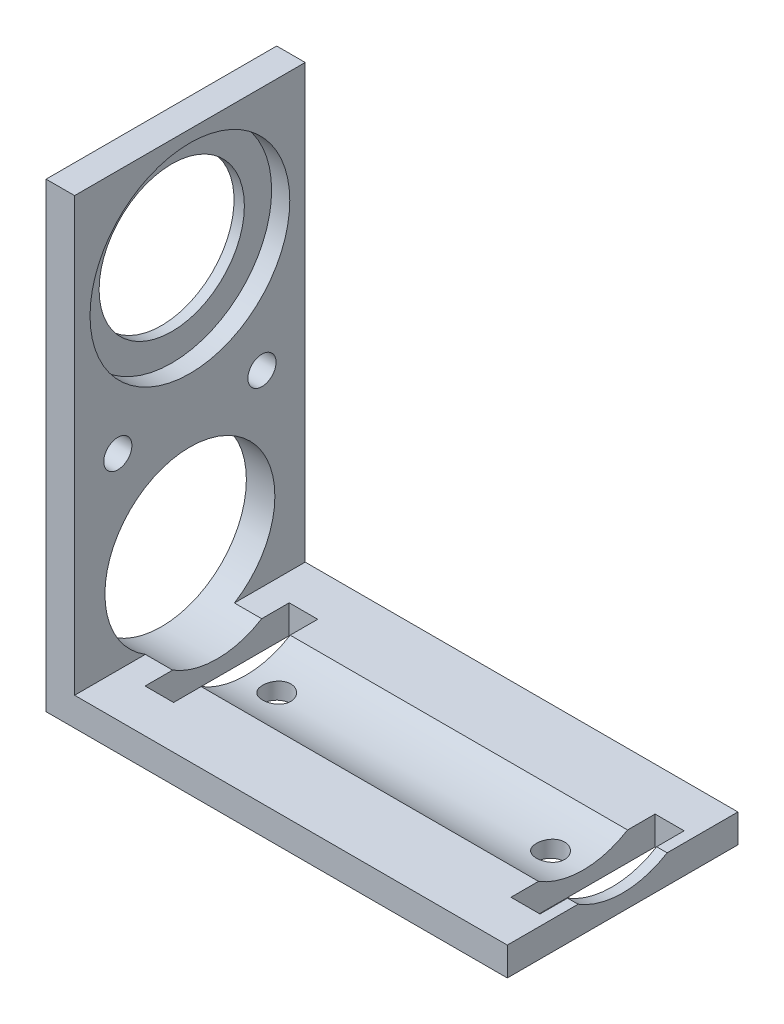
ISO-10303-21;
HEADER;
FILE_DESCRIPTION(('STEP AP214'),'2;1');
FILE_NAME('part.step','',(''),(''),'','','');
FILE_SCHEMA(('AUTOMOTIVE_DESIGN { 1 0 10303 214 1 1 1 1 }'));
ENDSEC;
DATA;
#1=APPLICATION_CONTEXT('core data for automotive mechanical design processes');
#2=APPLICATION_PROTOCOL_DEFINITION('international standard','automotive_design',2000,#1);
#3=PRODUCT_CONTEXT('',#1,'mechanical');
#4=PRODUCT('Part','Part','',(#3));
#5=PRODUCT_RELATED_PRODUCT_CATEGORY('part','',(#4));
#6=PRODUCT_DEFINITION_FORMATION('','',#4);
#7=PRODUCT_DEFINITION_CONTEXT('part definition',#1,'design');
#8=PRODUCT_DEFINITION('design','',#6,#7);
#9=PRODUCT_DEFINITION_SHAPE('','',#8);
#10=(LENGTH_UNIT() NAMED_UNIT(*) SI_UNIT(.MILLI.,.METRE.));
#11=(NAMED_UNIT(*) PLANE_ANGLE_UNIT() SI_UNIT($,.RADIAN.));
#12=(NAMED_UNIT(*) SI_UNIT($,.STERADIAN.) SOLID_ANGLE_UNIT());
#13=UNCERTAINTY_MEASURE_WITH_UNIT(LENGTH_MEASURE(1.E-05),#10,'distance_accuracy_value','');
#14=(GEOMETRIC_REPRESENTATION_CONTEXT(3) GLOBAL_UNCERTAINTY_ASSIGNED_CONTEXT((#13)) GLOBAL_UNIT_ASSIGNED_CONTEXT((#10,
#11,#12)) REPRESENTATION_CONTEXT('',''));
#15=CARTESIAN_POINT('',(0.,0.,0.));
#16=DIRECTION('',(0.,0.,1.));
#17=DIRECTION('',(1.,0.,0.));
#18=AXIS2_PLACEMENT_3D('',#15,#16,#17);
#19=CARTESIAN_POINT('',(50.8,11.1125,12.7));
#20=DIRECTION('',(-1.,0.,0.));
#21=DIRECTION('',(0.,0.,1.));
#22=AXIS2_PLACEMENT_3D('',#19,#20,#21);
#23=CYLINDRICAL_SURFACE('',#22,9.36);
#24=DIRECTION('',(-1.,0.,0.));
#25=VECTOR('',#24,1.);
#26=CARTESIAN_POINT('',(50.8,3.14,7.79603795385812));
#27=LINE('',#26,#25);
#28=CARTESIAN_POINT('',(49.64,3.14,7.79603795385812));
#29=VERTEX_POINT('',#28);
#30=CARTESIAN_POINT('',(50.8,3.14,7.79603795385812));
#31=VERTEX_POINT('',#30);
#32=EDGE_CURVE('E274',#29,#31,#27,.F.);
#33=ORIENTED_EDGE('',*,*,#32,.F.);
#34=CARTESIAN_POINT('',(49.64,11.1125,12.7));
#35=DIRECTION('',(1.,0.,0.));
#36=DIRECTION('',(0.,0.,-1.));
#37=AXIS2_PLACEMENT_3D('',#34,#35,#36);
#38=CIRCLE('',#37,9.36);
#39=CARTESIAN_POINT('',(49.64,3.14,17.6039620461419));
#40=VERTEX_POINT('',#39);
#41=EDGE_CURVE('E42',#29,#40,#38,.F.);
#42=ORIENTED_EDGE('',*,*,#41,.T.);
#43=DIRECTION('',(-1.,0.,0.));
#44=VECTOR('',#43,1.);
#45=CARTESIAN_POINT('',(50.8,3.14,17.6039620461419));
#46=LINE('',#45,#44);
#47=CARTESIAN_POINT('',(50.8,3.14,17.6039620461419));
#48=VERTEX_POINT('',#47);
#49=EDGE_CURVE('E280',#48,#40,#46,.T.);
#50=ORIENTED_EDGE('',*,*,#49,.F.);
#51=CARTESIAN_POINT('',(50.8,11.1125,12.7));
#52=DIRECTION('',(-1.,0.,0.));
#53=DIRECTION('',(0.,0.,1.));
#54=AXIS2_PLACEMENT_3D('',#51,#52,#53);
#55=CIRCLE('',#54,9.36);
#56=EDGE_CURVE('E271',#31,#48,#55,.T.);
#57=ORIENTED_EDGE('',*,*,#56,.F.);
#58=EDGE_LOOP('',(#33,#42,#50,#57));
#59=FACE_BOUND('',#58,.T.);
#60=ADVANCED_FACE('F29',(#59),#23,.F.);
#61=CARTESIAN_POINT('',(0.,11.1125,12.7));
#62=DIRECTION('',(-1.,0.,0.));
#63=DIRECTION('',(0.,0.,1.));
#64=AXIS2_PLACEMENT_3D('',#61,#62,#63);
#65=CIRCLE('',#64,9.36);
#66=CARTESIAN_POINT('',(0.,11.1125,22.06));
#67=VERTEX_POINT('',#66);
#68=EDGE_CURVE('E268',#67,#67,#65,.T.);
#69=ORIENTED_EDGE('',*,*,#68,.T.);
#70=EDGE_LOOP('',(#69));
#71=FACE_BOUND('',#70,.T.);
#72=CARTESIAN_POINT('',(6.14,3.14,17.6039620461419));
#73=VERTEX_POINT('',#72);
#74=CARTESIAN_POINT('',(3.14,3.14,17.6039620461419));
#75=VERTEX_POINT('',#74);
#76=EDGE_CURVE('E278',#73,#75,#46,.T.);
#77=ORIENTED_EDGE('',*,*,#76,.F.);
#78=CARTESIAN_POINT('',(6.14,11.1125,12.7));
#79=DIRECTION('',(-1.,0.,0.));
#80=DIRECTION('',(0.,0.,1.));
#81=AXIS2_PLACEMENT_3D('',#78,#79,#80);
#82=CIRCLE('',#81,9.36);
#83=CARTESIAN_POINT('',(6.14,3.14,7.79603795385812));
#84=VERTEX_POINT('',#83);
#85=EDGE_CURVE('E342',#73,#84,#82,.F.);
#86=ORIENTED_EDGE('',*,*,#85,.T.);
#87=CARTESIAN_POINT('',(3.14,3.14,7.79603795385812));
#88=VERTEX_POINT('',#87);
#89=EDGE_CURVE('E275',#88,#84,#27,.F.);
#90=ORIENTED_EDGE('',*,*,#89,.F.);
#91=CARTESIAN_POINT('',(3.14,11.1125,12.7));
#92=DIRECTION('',(-1.,0.,0.));
#93=DIRECTION('',(0.,0.,1.));
#94=AXIS2_PLACEMENT_3D('',#91,#92,#93);
#95=CIRCLE('',#94,9.36);
#96=EDGE_CURVE('E332',#75,#88,#95,.T.);
#97=ORIENTED_EDGE('',*,*,#96,.F.);
#98=EDGE_LOOP('',(#77,#86,#90,#97));
#99=FACE_BOUND('',#98,.T.);
#100=ADVANCED_FACE('F413',(#71,#99),#23,.F.);
#101=CARTESIAN_POINT('',(50.8,38.4725,12.7));
#102=DIRECTION('',(-1.,0.,0.));
#103=DIRECTION('',(0.,0.,1.));
#104=AXIS2_PLACEMENT_3D('',#101,#102,#103);
#105=CYLINDRICAL_SURFACE('',#104,8.);
#106=CARTESIAN_POINT('',(0.,38.4725,12.7));
#107=DIRECTION('',(-1.,0.,0.));
#108=DIRECTION('',(0.,0.,1.));
#109=AXIS2_PLACEMENT_3D('',#106,#107,#108);
#110=CIRCLE('',#109,8.);
#111=CARTESIAN_POINT('',(0.,38.4725,20.7));
#112=VERTEX_POINT('',#111);
#113=EDGE_CURVE('E265',#112,#112,#110,.T.);
#114=ORIENTED_EDGE('',*,*,#113,.T.);
#115=EDGE_LOOP('',(#114));
#116=FACE_BOUND('',#115,.T.);
#117=CARTESIAN_POINT('',(1.14,38.4725,12.7));
#118=DIRECTION('',(1.,0.,0.));
#119=DIRECTION('',(0.,0.,-1.));
#120=AXIS2_PLACEMENT_3D('',#117,#118,#119);
#121=CIRCLE('',#120,8.);
#122=CARTESIAN_POINT('',(1.14,38.4725,4.7));
#123=VERTEX_POINT('',#122);
#124=EDGE_CURVE('E254',#123,#123,#121,.F.);
#125=ORIENTED_EDGE('',*,*,#124,.F.);
#126=EDGE_LOOP('',(#125));
#127=FACE_BOUND('',#126,.T.);
#128=ADVANCED_FACE('F410',(#116,#127),#105,.F.);
#129=CARTESIAN_POINT('',(50.8,3.14,25.4));
#130=DIRECTION('',(0.,-1.,0.));
#131=DIRECTION('',(1.,0.,0.));
#132=AXIS2_PLACEMENT_3D('',#129,#130,#131);
#133=PLANE('',#132);
#134=DIRECTION('',(-1.,0.,0.));
#135=VECTOR('',#134,1.);
#136=CARTESIAN_POINT('',(50.8,3.14,20.6375));
#137=LINE('',#136,#135);
#138=CARTESIAN_POINT('',(49.64,3.14,20.6375));
#139=VERTEX_POINT('',#138);
#140=CARTESIAN_POINT('',(46.44,3.14,20.6375));
#141=VERTEX_POINT('',#140);
#142=EDGE_CURVE('E211',#139,#141,#137,.T.);
#143=ORIENTED_EDGE('',*,*,#142,.T.);
#144=DIRECTION('',(0.,0.,-1.));
#145=VECTOR('',#144,1.);
#146=CARTESIAN_POINT('',(46.44,3.14,25.4));
#147=LINE('',#146,#145);
#148=CARTESIAN_POINT('',(46.44,3.14,17.6039620461419));
#149=VERTEX_POINT('',#148);
#150=EDGE_CURVE('E180',#141,#149,#147,.T.);
#151=ORIENTED_EDGE('',*,*,#150,.T.);
#152=CARTESIAN_POINT('',(9.28,3.14,17.6039620461419));
#153=VERTEX_POINT('',#152);
#154=EDGE_CURVE('E284',#149,#153,#46,.T.);
#155=ORIENTED_EDGE('',*,*,#154,.T.);
#156=DIRECTION('',(0.,0.,1.));
#157=VECTOR('',#156,1.);
#158=CARTESIAN_POINT('',(9.28,3.14,25.4));
#159=LINE('',#158,#157);
#160=CARTESIAN_POINT('',(9.28,3.14,20.6375));
#161=VERTEX_POINT('',#160);
#162=EDGE_CURVE('E236',#153,#161,#159,.T.);
#163=ORIENTED_EDGE('',*,*,#162,.T.);
#164=DIRECTION('',(-1.,0.,0.));
#165=VECTOR('',#164,1.);
#166=CARTESIAN_POINT('',(50.8,3.14,20.6375));
#167=LINE('',#166,#165);
#168=CARTESIAN_POINT('',(6.14,3.14,20.6375));
#169=VERTEX_POINT('',#168);
#170=EDGE_CURVE('E245',#161,#169,#167,.T.);
#171=ORIENTED_EDGE('',*,*,#170,.T.);
#172=DIRECTION('',(0.,0.,-1.));
#173=VECTOR('',#172,1.);
#174=CARTESIAN_POINT('',(6.14,3.14,25.4));
#175=LINE('',#174,#173);
#176=EDGE_CURVE('E242',#169,#73,#175,.T.);
#177=ORIENTED_EDGE('',*,*,#176,.T.);
#178=ORIENTED_EDGE('',*,*,#76,.T.);
#179=DIRECTION('',(0.,0.,-1.));
#180=VECTOR('',#179,1.);
#181=CARTESIAN_POINT('',(3.14,3.14,25.4));
#182=LINE('',#181,#180);
#183=CARTESIAN_POINT('',(3.14,3.14,25.4));
#184=VERTEX_POINT('',#183);
#185=EDGE_CURVE('E319',#184,#75,#182,.T.);
#186=ORIENTED_EDGE('',*,*,#185,.F.);
#187=DIRECTION('',(-1.,0.,0.));
#188=VECTOR('',#187,1.);
#189=CARTESIAN_POINT('',(50.8,3.14,25.4));
#190=LINE('',#189,#188);
#191=CARTESIAN_POINT('',(50.8,3.14,25.4));
#192=VERTEX_POINT('',#191);
#193=EDGE_CURVE('E306',#192,#184,#190,.T.);
#194=ORIENTED_EDGE('',*,*,#193,.F.);
#195=DIRECTION('',(0.,0.,-1.));
#196=VECTOR('',#195,1.);
#197=CARTESIAN_POINT('',(50.8,3.14,25.4));
#198=LINE('',#197,#196);
#199=EDGE_CURVE('E323',#192,#48,#198,.T.);
#200=ORIENTED_EDGE('',*,*,#199,.T.);
#201=ORIENTED_EDGE('',*,*,#49,.T.);
#202=DIRECTION('',(0.,0.,1.));
#203=VECTOR('',#202,1.);
#204=CARTESIAN_POINT('',(49.64,3.14,25.4));
#205=LINE('',#204,#203);
#206=EDGE_CURVE('E208',#40,#139,#205,.T.);
#207=ORIENTED_EDGE('',*,*,#206,.T.);
#208=EDGE_LOOP('',(#143,#151,#155,#163,#171,#177,#178,#186,#194,#200,#201,#207));
#209=FACE_BOUND('',#208,.T.);
#210=ADVANCED_FACE('F412',(#209),#133,.F.);
#211=CARTESIAN_POINT('',(0.,50.8,25.4));
#212=DIRECTION('',(1.,0.,0.));
#213=DIRECTION('',(0.,0.,-1.));
#214=AXIS2_PLACEMENT_3D('',#211,#212,#213);
#215=PLANE('',#214);
#216=CARTESIAN_POINT('',(0.,23.8125,20.6375));
#217=DIRECTION('',(-1.,0.,0.));
#218=DIRECTION('',(0.,0.,1.));
#219=AXIS2_PLACEMENT_3D('',#216,#217,#218);
#220=CIRCLE('',#219,1.55);
#221=CARTESIAN_POINT('',(0.,23.8125,22.1875));
#222=VERTEX_POINT('',#221);
#223=EDGE_CURVE('E255',#222,#222,#220,.T.);
#224=ORIENTED_EDGE('',*,*,#223,.F.);
#225=EDGE_LOOP('',(#224));
#226=FACE_BOUND('',#225,.T.);
#227=CARTESIAN_POINT('',(0.,23.8125,4.7625));
#228=DIRECTION('',(-1.,0.,0.));
#229=DIRECTION('',(0.,0.,1.));
#230=AXIS2_PLACEMENT_3D('',#227,#228,#229);
#231=CIRCLE('',#230,1.55);
#232=CARTESIAN_POINT('',(0.,23.8125,6.3125));
#233=VERTEX_POINT('',#232);
#234=EDGE_CURVE('E261',#233,#233,#231,.T.);
#235=ORIENTED_EDGE('',*,*,#234,.F.);
#236=EDGE_LOOP('',(#235));
#237=FACE_BOUND('',#236,.T.);
#238=ORIENTED_EDGE('',*,*,#113,.F.);
#239=EDGE_LOOP('',(#238));
#240=FACE_BOUND('',#239,.T.);
#241=ORIENTED_EDGE('',*,*,#68,.F.);
#242=EDGE_LOOP('',(#241));
#243=FACE_BOUND('',#242,.T.);
#244=DIRECTION('',(0.,-1.,0.));
#245=VECTOR('',#244,1.);
#246=CARTESIAN_POINT('',(0.,50.8,0.));
#247=LINE('',#246,#245);
#248=CARTESIAN_POINT('',(0.,50.8,0.));
#249=VERTEX_POINT('',#248);
#250=CARTESIAN_POINT('',(0.,0.,0.));
#251=VERTEX_POINT('',#250);
#252=EDGE_CURVE('E283',#249,#251,#247,.T.);
#253=ORIENTED_EDGE('',*,*,#252,.T.);
#254=DIRECTION('',(0.,0.,-1.));
#255=VECTOR('',#254,1.);
#256=CARTESIAN_POINT('',(0.,0.,25.4));
#257=LINE('',#256,#255);
#258=CARTESIAN_POINT('',(0.,0.,25.4));
#259=VERTEX_POINT('',#258);
#260=EDGE_CURVE('E329',#259,#251,#257,.T.);
#261=ORIENTED_EDGE('',*,*,#260,.F.);
#262=DIRECTION('',(0.,-1.,0.));
#263=VECTOR('',#262,1.);
#264=CARTESIAN_POINT('',(0.,50.8,25.4));
#265=LINE('',#264,#263);
#266=CARTESIAN_POINT('',(0.,50.8,25.4));
#267=VERTEX_POINT('',#266);
#268=EDGE_CURVE('E299',#267,#259,#265,.T.);
#269=ORIENTED_EDGE('',*,*,#268,.F.);
#270=DIRECTION('',(0.,0.,-1.));
#271=VECTOR('',#270,1.);
#272=CARTESIAN_POINT('',(0.,50.8,25.4));
#273=LINE('',#272,#271);
#274=EDGE_CURVE('E312',#267,#249,#273,.T.);
#275=ORIENTED_EDGE('',*,*,#274,.T.);
#276=EDGE_LOOP('',(#253,#261,#269,#275));
#277=FACE_BOUND('',#276,.T.);
#278=ADVANCED_FACE('F31',(#226,#237,#240,#243,#277),#215,.F.);
#279=CARTESIAN_POINT('',(0.,0.,25.4));
#280=DIRECTION('',(0.,1.,0.));
#281=DIRECTION('',(0.,0.,1.));
#282=AXIS2_PLACEMENT_3D('',#279,#280,#281);
#283=PLANE('',#282);
#284=CARTESIAN_POINT('',(42.86,0.,12.7));
#285=DIRECTION('',(0.,-1.,0.));
#286=DIRECTION('',(0.,0.,-1.));
#287=AXIS2_PLACEMENT_3D('',#284,#285,#286);
#288=CIRCLE('',#287,1.55);
#289=CARTESIAN_POINT('',(42.86,0.,11.15));
#290=VERTEX_POINT('',#289);
#291=EDGE_CURVE('E470',#290,#290,#288,.T.);
#292=ORIENTED_EDGE('',*,*,#291,.F.);
#293=EDGE_LOOP('',(#292));
#294=FACE_BOUND('',#293,.T.);
#295=CARTESIAN_POINT('',(12.7,0.,12.7));
#296=DIRECTION('',(0.,-1.,0.));
#297=DIRECTION('',(0.,0.,-1.));
#298=AXIS2_PLACEMENT_3D('',#295,#296,#297);
#299=CIRCLE('',#298,1.55);
#300=CARTESIAN_POINT('',(12.7,0.,11.15));
#301=VERTEX_POINT('',#300);
#302=EDGE_CURVE('E356',#301,#301,#299,.T.);
#303=ORIENTED_EDGE('',*,*,#302,.F.);
#304=EDGE_LOOP('',(#303));
#305=FACE_BOUND('',#304,.T.);
#306=DIRECTION('',(-1.,0.,0.));
#307=VECTOR('',#306,1.);
#308=CARTESIAN_POINT('',(49.64,0.,20.6375));
#309=LINE('',#308,#307);
#310=CARTESIAN_POINT('',(49.64,0.,20.6375));
#311=VERTEX_POINT('',#310);
#312=CARTESIAN_POINT('',(46.44,0.,20.6375));
#313=VERTEX_POINT('',#312);
#314=EDGE_CURVE('E187',#311,#313,#309,.T.);
#315=ORIENTED_EDGE('',*,*,#314,.F.);
#316=DIRECTION('',(0.,0.,1.));
#317=VECTOR('',#316,1.);
#318=CARTESIAN_POINT('',(49.64,0.,20.6375));
#319=LINE('',#318,#317);
#320=CARTESIAN_POINT('',(49.64,0.,4.7625));
#321=VERTEX_POINT('',#320);
#322=EDGE_CURVE('E50',#321,#311,#319,.T.);
#323=ORIENTED_EDGE('',*,*,#322,.F.);
#324=DIRECTION('',(1.,0.,0.));
#325=VECTOR('',#324,1.);
#326=CARTESIAN_POINT('',(49.64,0.,4.7625));
#327=LINE('',#326,#325);
#328=CARTESIAN_POINT('',(46.44,0.,4.7625));
#329=VERTEX_POINT('',#328);
#330=EDGE_CURVE('E194',#329,#321,#327,.T.);
#331=ORIENTED_EDGE('',*,*,#330,.F.);
#332=DIRECTION('',(0.,0.,-1.));
#333=VECTOR('',#332,1.);
#334=CARTESIAN_POINT('',(46.44,0.,20.6375));
#335=LINE('',#334,#333);
#336=EDGE_CURVE('E177',#313,#329,#335,.T.);
#337=ORIENTED_EDGE('',*,*,#336,.F.);
#338=EDGE_LOOP('',(#315,#323,#331,#337));
#339=FACE_BOUND('',#338,.T.);
#340=DIRECTION('',(1.,0.,0.));
#341=VECTOR('',#340,1.);
#342=CARTESIAN_POINT('',(6.14,0.,4.7625));
#343=LINE('',#342,#341);
#344=CARTESIAN_POINT('',(6.14,0.,4.7625));
#345=VERTEX_POINT('',#344);
#346=CARTESIAN_POINT('',(9.28,0.,4.7625));
#347=VERTEX_POINT('',#346);
#348=EDGE_CURVE('E215',#345,#347,#343,.T.);
#349=ORIENTED_EDGE('',*,*,#348,.F.);
#350=DIRECTION('',(0.,0.,-1.));
#351=VECTOR('',#350,1.);
#352=CARTESIAN_POINT('',(6.14,0.,4.7625));
#353=LINE('',#352,#351);
#354=CARTESIAN_POINT('',(6.14,0.,20.6375));
#355=VERTEX_POINT('',#354);
#356=EDGE_CURVE('E213',#355,#345,#353,.T.);
#357=ORIENTED_EDGE('',*,*,#356,.F.);
#358=DIRECTION('',(-1.,0.,0.));
#359=VECTOR('',#358,1.);
#360=CARTESIAN_POINT('',(6.14,0.,20.6375));
#361=LINE('',#360,#359);
#362=CARTESIAN_POINT('',(9.28,0.,20.6375));
#363=VERTEX_POINT('',#362);
#364=EDGE_CURVE('E221',#363,#355,#361,.T.);
#365=ORIENTED_EDGE('',*,*,#364,.F.);
#366=DIRECTION('',(0.,0.,1.));
#367=VECTOR('',#366,1.);
#368=CARTESIAN_POINT('',(9.28,0.,4.7625));
#369=LINE('',#368,#367);
#370=EDGE_CURVE('E218',#347,#363,#369,.T.);
#371=ORIENTED_EDGE('',*,*,#370,.F.);
#372=EDGE_LOOP('',(#349,#357,#365,#371));
#373=FACE_BOUND('',#372,.T.);
#374=DIRECTION('',(1.,0.,0.));
#375=VECTOR('',#374,1.);
#376=CARTESIAN_POINT('',(0.,0.,0.));
#377=LINE('',#376,#375);
#378=CARTESIAN_POINT('',(50.8,0.,0.));
#379=VERTEX_POINT('',#378);
#380=EDGE_CURVE('E287',#251,#379,#377,.T.);
#381=ORIENTED_EDGE('',*,*,#380,.T.);
#382=DIRECTION('',(0.,0.,-1.));
#383=VECTOR('',#382,1.);
#384=CARTESIAN_POINT('',(50.8,0.,25.4));
#385=LINE('',#384,#383);
#386=CARTESIAN_POINT('',(50.8,0.,25.4));
#387=VERTEX_POINT('',#386);
#388=EDGE_CURVE('E326',#387,#379,#385,.T.);
#389=ORIENTED_EDGE('',*,*,#388,.F.);
#390=DIRECTION('',(1.,0.,0.));
#391=VECTOR('',#390,1.);
#392=CARTESIAN_POINT('',(0.,0.,25.4));
#393=LINE('',#392,#391);
#394=EDGE_CURVE('E302',#259,#387,#393,.T.);
#395=ORIENTED_EDGE('',*,*,#394,.F.);
#396=ORIENTED_EDGE('',*,*,#260,.T.);
#397=EDGE_LOOP('',(#381,#389,#395,#396));
#398=FACE_BOUND('',#397,.T.);
#399=ADVANCED_FACE('F191',(#294,#305,#339,#373,#398),#283,.F.);
#400=CARTESIAN_POINT('',(50.8,0.,25.4));
#401=DIRECTION('',(-1.,0.,0.));
#402=DIRECTION('',(0.,0.,1.));
#403=AXIS2_PLACEMENT_3D('',#400,#401,#402);
#404=PLANE('',#403);
#405=CARTESIAN_POINT('',(50.8,3.14,0.));
#406=VERTEX_POINT('',#405);
#407=EDGE_CURVE('E322',#31,#406,#198,.T.);
#408=ORIENTED_EDGE('',*,*,#407,.F.);
#409=ORIENTED_EDGE('',*,*,#56,.T.);
#410=ORIENTED_EDGE('',*,*,#199,.F.);
#411=DIRECTION('',(0.,1.,0.));
#412=VECTOR('',#411,1.);
#413=CARTESIAN_POINT('',(50.8,0.,25.4));
#414=LINE('',#413,#412);
#415=EDGE_CURVE('E304',#387,#192,#414,.T.);
#416=ORIENTED_EDGE('',*,*,#415,.F.);
#417=ORIENTED_EDGE('',*,*,#388,.T.);
#418=DIRECTION('',(0.,1.,0.));
#419=VECTOR('',#418,1.);
#420=CARTESIAN_POINT('',(50.8,0.,0.));
#421=LINE('',#420,#419);
#422=EDGE_CURVE('E289',#379,#406,#421,.T.);
#423=ORIENTED_EDGE('',*,*,#422,.T.);
#424=EDGE_LOOP('',(#408,#409,#410,#416,#417,#423));
#425=FACE_BOUND('',#424,.T.);
#426=ADVANCED_FACE('F463',(#425),#404,.F.);
#427=DIRECTION('',(1.,0.,0.));
#428=VECTOR('',#427,1.);
#429=CARTESIAN_POINT('',(50.8,3.14,4.7625));
#430=LINE('',#429,#428);
#431=CARTESIAN_POINT('',(46.44,3.14,4.7625));
#432=VERTEX_POINT('',#431);
#433=CARTESIAN_POINT('',(49.64,3.14,4.7625));
#434=VERTEX_POINT('',#433);
#435=EDGE_CURVE('E11',#432,#434,#430,.T.);
#436=ORIENTED_EDGE('',*,*,#435,.T.);
#437=DIRECTION('',(0.,0.,1.));
#438=VECTOR('',#437,1.);
#439=CARTESIAN_POINT('',(49.64,3.14,25.4));
#440=LINE('',#439,#438);
#441=EDGE_CURVE('E205',#434,#29,#440,.T.);
#442=ORIENTED_EDGE('',*,*,#441,.T.);
#443=ORIENTED_EDGE('',*,*,#32,.T.);
#444=ORIENTED_EDGE('',*,*,#407,.T.);
#445=DIRECTION('',(-1.,0.,0.));
#446=VECTOR('',#445,1.);
#447=CARTESIAN_POINT('',(50.8,3.14,0.));
#448=LINE('',#447,#446);
#449=CARTESIAN_POINT('',(3.14,3.14,0.));
#450=VERTEX_POINT('',#449);
#451=EDGE_CURVE('E292',#406,#450,#448,.T.);
#452=ORIENTED_EDGE('',*,*,#451,.T.);
#453=EDGE_CURVE('E318',#88,#450,#182,.T.);
#454=ORIENTED_EDGE('',*,*,#453,.F.);
#455=ORIENTED_EDGE('',*,*,#89,.T.);
#456=DIRECTION('',(0.,0.,-1.));
#457=VECTOR('',#456,1.);
#458=CARTESIAN_POINT('',(6.14,3.14,25.4));
#459=LINE('',#458,#457);
#460=CARTESIAN_POINT('',(6.14,3.14,4.7625));
#461=VERTEX_POINT('',#460);
#462=EDGE_CURVE('E239',#84,#461,#459,.T.);
#463=ORIENTED_EDGE('',*,*,#462,.T.);
#464=DIRECTION('',(1.,0.,0.));
#465=VECTOR('',#464,1.);
#466=CARTESIAN_POINT('',(50.8,3.14,4.7625));
#467=LINE('',#466,#465);
#468=CARTESIAN_POINT('',(9.28,3.14,4.7625));
#469=VERTEX_POINT('',#468);
#470=EDGE_CURVE('E345',#461,#469,#467,.T.);
#471=ORIENTED_EDGE('',*,*,#470,.T.);
#472=DIRECTION('',(0.,0.,1.));
#473=VECTOR('',#472,1.);
#474=CARTESIAN_POINT('',(9.28,3.14,25.4));
#475=LINE('',#474,#473);
#476=CARTESIAN_POINT('',(9.28,3.14,7.79603795385812));
#477=VERTEX_POINT('',#476);
#478=EDGE_CURVE('E227',#469,#477,#475,.T.);
#479=ORIENTED_EDGE('',*,*,#478,.T.);
#480=CARTESIAN_POINT('',(46.44,3.14,7.79603795385812));
#481=VERTEX_POINT('',#480);
#482=EDGE_CURVE('E279',#477,#481,#27,.F.);
#483=ORIENTED_EDGE('',*,*,#482,.T.);
#484=DIRECTION('',(0.,0.,-1.));
#485=VECTOR('',#484,1.);
#486=CARTESIAN_POINT('',(46.44,3.14,25.4));
#487=LINE('',#486,#485);
#488=EDGE_CURVE('E58',#481,#432,#487,.T.);
#489=ORIENTED_EDGE('',*,*,#488,.T.);
#490=EDGE_LOOP('',(#436,#442,#443,#444,#452,#454,#455,#463,#471,#479,#483,#489));
#491=FACE_BOUND('',#490,.T.);
#492=ADVANCED_FACE('F421',(#491),#133,.F.);
#493=CARTESIAN_POINT('',(3.14,3.14,25.4));
#494=DIRECTION('',(-1.,0.,0.));
#495=DIRECTION('',(0.,0.,1.));
#496=AXIS2_PLACEMENT_3D('',#493,#494,#495);
#497=PLANE('',#496);
#498=CARTESIAN_POINT('',(3.14,38.4725,12.7));
#499=DIRECTION('',(1.,0.,0.));
#500=DIRECTION('',(0.,0.,-1.));
#501=AXIS2_PLACEMENT_3D('',#498,#499,#500);
#502=CIRCLE('',#501,11.);
#503=CARTESIAN_POINT('',(3.14,38.4725,1.7));
#504=VERTEX_POINT('',#503);
#505=EDGE_CURVE('E248',#504,#504,#502,.T.);
#506=ORIENTED_EDGE('',*,*,#505,.F.);
#507=EDGE_LOOP('',(#506));
#508=FACE_BOUND('',#507,.T.);
#509=CARTESIAN_POINT('',(3.14,23.8125,20.6375));
#510=DIRECTION('',(-1.,0.,0.));
#511=DIRECTION('',(0.,0.,1.));
#512=AXIS2_PLACEMENT_3D('',#509,#510,#511);
#513=CIRCLE('',#512,1.55);
#514=CARTESIAN_POINT('',(3.14,23.8125,22.1875));
#515=VERTEX_POINT('',#514);
#516=EDGE_CURVE('E258',#515,#515,#513,.T.);
#517=ORIENTED_EDGE('',*,*,#516,.T.);
#518=EDGE_LOOP('',(#517));
#519=FACE_BOUND('',#518,.T.);
#520=CARTESIAN_POINT('',(3.14,23.8125,4.7625));
#521=DIRECTION('',(-1.,0.,0.));
#522=DIRECTION('',(0.,0.,1.));
#523=AXIS2_PLACEMENT_3D('',#520,#521,#522);
#524=CIRCLE('',#523,1.55);
#525=CARTESIAN_POINT('',(3.14,23.8125,6.3125));
#526=VERTEX_POINT('',#525);
#527=EDGE_CURVE('E264',#526,#526,#524,.T.);
#528=ORIENTED_EDGE('',*,*,#527,.T.);
#529=EDGE_LOOP('',(#528));
#530=FACE_BOUND('',#529,.T.);
#531=ORIENTED_EDGE('',*,*,#185,.T.);
#532=ORIENTED_EDGE('',*,*,#96,.T.);
#533=ORIENTED_EDGE('',*,*,#453,.T.);
#534=DIRECTION('',(0.,1.,0.));
#535=VECTOR('',#534,1.);
#536=CARTESIAN_POINT('',(3.14,3.14,0.));
#537=LINE('',#536,#535);
#538=CARTESIAN_POINT('',(3.14,50.8,0.));
#539=VERTEX_POINT('',#538);
#540=EDGE_CURVE('E295',#450,#539,#537,.T.);
#541=ORIENTED_EDGE('',*,*,#540,.T.);
#542=DIRECTION('',(0.,0.,-1.));
#543=VECTOR('',#542,1.);
#544=CARTESIAN_POINT('',(3.14,50.8,25.4));
#545=LINE('',#544,#543);
#546=CARTESIAN_POINT('',(3.14,50.8,25.4));
#547=VERTEX_POINT('',#546);
#548=EDGE_CURVE('E315',#547,#539,#545,.T.);
#549=ORIENTED_EDGE('',*,*,#548,.F.);
#550=DIRECTION('',(0.,1.,0.));
#551=VECTOR('',#550,1.);
#552=CARTESIAN_POINT('',(3.14,3.14,25.4));
#553=LINE('',#552,#551);
#554=EDGE_CURVE('E308',#184,#547,#553,.T.);
#555=ORIENTED_EDGE('',*,*,#554,.F.);
#556=EDGE_LOOP('',(#531,#532,#533,#541,#549,#555));
#557=FACE_BOUND('',#556,.T.);
#558=ADVANCED_FACE('F454',(#508,#519,#530,#557),#497,.F.);
#559=CARTESIAN_POINT('',(3.14,50.8,25.4));
#560=DIRECTION('',(0.,-1.,0.));
#561=DIRECTION('',(0.,0.,-1.));
#562=AXIS2_PLACEMENT_3D('',#559,#560,#561);
#563=PLANE('',#562);
#564=DIRECTION('',(-1.,0.,0.));
#565=VECTOR('',#564,1.);
#566=CARTESIAN_POINT('',(3.14,50.8,0.));
#567=LINE('',#566,#565);
#568=EDGE_CURVE('E297',#539,#249,#567,.T.);
#569=ORIENTED_EDGE('',*,*,#568,.T.);
#570=ORIENTED_EDGE('',*,*,#274,.F.);
#571=DIRECTION('',(-1.,0.,0.));
#572=VECTOR('',#571,1.);
#573=CARTESIAN_POINT('',(3.14,50.8,25.4));
#574=LINE('',#573,#572);
#575=EDGE_CURVE('E310',#547,#267,#574,.T.);
#576=ORIENTED_EDGE('',*,*,#575,.F.);
#577=ORIENTED_EDGE('',*,*,#548,.T.);
#578=EDGE_LOOP('',(#569,#570,#576,#577));
#579=FACE_BOUND('',#578,.T.);
#580=ADVANCED_FACE('F490',(#579),#563,.F.);
#581=CARTESIAN_POINT('',(0.,0.,25.4));
#582=DIRECTION('',(0.,0.,1.));
#583=DIRECTION('',(1.,0.,0.));
#584=AXIS2_PLACEMENT_3D('',#581,#582,#583);
#585=PLANE('',#584);
#586=ORIENTED_EDGE('',*,*,#268,.T.);
#587=ORIENTED_EDGE('',*,*,#394,.T.);
#588=ORIENTED_EDGE('',*,*,#415,.T.);
#589=ORIENTED_EDGE('',*,*,#193,.T.);
#590=ORIENTED_EDGE('',*,*,#554,.T.);
#591=ORIENTED_EDGE('',*,*,#575,.T.);
#592=EDGE_LOOP('',(#586,#587,#588,#589,#590,#591));
#593=FACE_BOUND('',#592,.T.);
#594=ADVANCED_FACE('F435',(#593),#585,.T.);
#595=CARTESIAN_POINT('',(0.,0.,0.));
#596=DIRECTION('',(0.,0.,1.));
#597=DIRECTION('',(1.,0.,0.));
#598=AXIS2_PLACEMENT_3D('',#595,#596,#597);
#599=PLANE('',#598);
#600=ORIENTED_EDGE('',*,*,#252,.F.);
#601=ORIENTED_EDGE('',*,*,#568,.F.);
#602=ORIENTED_EDGE('',*,*,#540,.F.);
#603=ORIENTED_EDGE('',*,*,#451,.F.);
#604=ORIENTED_EDGE('',*,*,#422,.F.);
#605=ORIENTED_EDGE('',*,*,#380,.F.);
#606=EDGE_LOOP('',(#600,#601,#602,#603,#604,#605));
#607=FACE_BOUND('',#606,.T.);
#608=ADVANCED_FACE('F430',(#607),#599,.F.);
#609=CARTESIAN_POINT('',(42.86,1.88173080128205,11.15));
#610=CARTESIAN_POINT('',(42.9464213184193,1.88172924807784,11.1500034802225));
#611=CARTESIAN_POINT('',(43.0328900299313,1.88050399516517,11.1572521949747));
#612=CARTESIAN_POINT('',(43.2034018685287,1.87573975841751,11.1860432567901));
#613=CARTESIAN_POINT('',(43.2874426748331,1.87219863263112,11.207598836551));
#614=CARTESIAN_POINT('',(43.4506063095449,1.86321446730342,11.2643341775684));
#615=CARTESIAN_POINT('',(43.5297331622489,1.85777300889808,11.2995026151308));
#616=CARTESIAN_POINT('',(43.6809543371228,1.8456031631551,11.3824372716858));
#617=CARTESIAN_POINT('',(43.753049461213,1.83887492282584,11.4302020518457));
#618=CARTESIAN_POINT('',(43.8888711094809,1.82481644328682,11.5374694600292));
#619=CARTESIAN_POINT('',(43.952519267487,1.81748147078467,11.5970707081404));
#620=CARTESIAN_POINT('',(44.0689596812409,1.80307805509958,11.72610608113));
#621=CARTESIAN_POINT('',(44.1217512967813,1.79600962765479,11.7955407854772));
#622=CARTESIAN_POINT('',(44.2152738515959,1.78288567284242,11.9427794549213));
#623=CARTESIAN_POINT('',(44.2559319086684,1.77683635783016,12.0206303140866));
#624=CARTESIAN_POINT('',(44.3235648031853,1.76648487800087,12.1821735636913));
#625=CARTESIAN_POINT('',(44.3505405190726,1.76218260102285,12.2658655787204));
#626=CARTESIAN_POINT('',(44.3898034470881,1.75584335983692,12.4359059737125));
#627=CARTESIAN_POINT('',(44.4022223003381,1.75378610526782,12.5222231884965));
#628=CARTESIAN_POINT('',(44.4124282859557,1.75209900509318,12.695739043761));
#629=CARTESIAN_POINT('',(44.4102164007041,1.75246899651023,12.7829376246697));
#630=CARTESIAN_POINT('',(44.391326440757,1.75557862818321,12.954841028199));
#631=CARTESIAN_POINT('',(44.3747900345495,1.75829506155522,13.0395618981535));
#632=CARTESIAN_POINT('',(44.3279434708393,1.76576648163791,13.2050094936637));
#633=CARTESIAN_POINT('',(44.2976328980468,1.77052152981241,13.2857360987113));
#634=CARTESIAN_POINT('',(44.2239573300137,1.78157543305082,13.4413254482908));
#635=CARTESIAN_POINT('',(44.1805338748082,1.7878811775741,13.5161600011114));
#636=CARTESIAN_POINT('',(44.0819079951043,1.8013357515359,13.6575336980142));
#637=CARTESIAN_POINT('',(44.0267046291666,1.80848464833792,13.7240721784084));
#638=CARTESIAN_POINT('',(43.9052999694191,1.82293140358676,13.8478018291842));
#639=CARTESIAN_POINT('',(43.8389748656788,1.8302300206333,13.9048714945345));
#640=CARTESIAN_POINT('',(43.6976268539006,1.84407075230153,14.0070915212008));
#641=CARTESIAN_POINT('',(43.6226038676142,1.85061286011641,14.0522417752746));
#642=CARTESIAN_POINT('',(43.4658497532563,1.86220019927888,14.1293647200348));
#643=CARTESIAN_POINT('',(43.3841113681792,1.86724378334585,14.1613229240189));
#644=CARTESIAN_POINT('',(43.216324400161,1.87523563214956,14.2110217494827));
#645=CARTESIAN_POINT('',(43.1302761922752,1.8781840788743,14.228763605841));
#646=CARTESIAN_POINT('',(42.9573989087514,1.88161665596357,14.2493553126814));
#647=CARTESIAN_POINT('',(42.87059100674,1.88212943600626,14.252378305358));
#648=CARTESIAN_POINT('',(42.6977094769245,1.88070891475186,14.2439077371098));
#649=CARTESIAN_POINT('',(42.6116358212633,1.87877570667433,14.2324147294075));
#650=CARTESIAN_POINT('',(42.4432151890963,1.87270749285167,14.1953859739356));
#651=CARTESIAN_POINT('',(42.3608483222939,1.8685862909596,14.1699382325709));
#652=CARTESIAN_POINT('',(42.2015483407116,1.85861801619276,14.1058146278662));
#653=CARTESIAN_POINT('',(42.1246155475745,1.8527708412636,14.067137982298));
#654=CARTESIAN_POINT('',(41.9775965979312,1.83994281950354,13.9772453238817));
#655=CARTESIAN_POINT('',(41.9075792030518,1.8329521296987,13.9259182815822));
#656=CARTESIAN_POINT('',(41.777089206799,1.81865360096041,13.8123343391318));
#657=CARTESIAN_POINT('',(41.7166172684102,1.81134574004258,13.7500766804231));
#658=CARTESIAN_POINT('',(41.6063032129337,1.79714573272633,13.6156319830422));
#659=CARTESIAN_POINT('',(41.5565765149833,1.79025862043172,13.5433496288884));
#660=CARTESIAN_POINT('',(41.4699726607409,1.77775669967954,13.3913564202497));
#661=CARTESIAN_POINT('',(41.4330950929241,1.77214185047665,13.3116458037767));
#662=CARTESIAN_POINT('',(41.3734162477439,1.76283898961768,13.1474028173267));
#663=CARTESIAN_POINT('',(41.3505543907965,1.75914269624834,13.0628929485603));
#664=CARTESIAN_POINT('',(41.3193607998756,1.7540584232268,12.8911672071351));
#665=CARTESIAN_POINT('',(41.3110278862639,1.75267025617295,12.8039515547504));
#666=CARTESIAN_POINT('',(41.3091623226423,1.75236124174706,12.6304043524786));
#667=CARTESIAN_POINT('',(41.3154539929799,1.75341110706104,12.5440746927113));
#668=CARTESIAN_POINT('',(41.3422792420473,1.75780045392587,12.3737196870954));
#669=CARTESIAN_POINT('',(41.3628127435021,1.7611399230535,12.2896943287465));
#670=CARTESIAN_POINT('',(41.4174717055774,1.76973459570866,12.1263989243915));
#671=CARTESIAN_POINT('',(41.4515824136541,1.77498771939891,12.047123824128));
#672=CARTESIAN_POINT('',(41.5324080058407,1.78683601213513,11.8953949322581));
#673=CARTESIAN_POINT('',(41.5791234750776,1.79343124347974,11.8229414575299));
#674=CARTESIAN_POINT('',(41.6844561413798,1.80732646533828,11.6860271188184));
#675=CARTESIAN_POINT('',(41.743202058025,1.81463358748333,11.6216659962334));
#676=CARTESIAN_POINT('',(41.870657847441,1.82907942527103,11.5036529486908));
#677=CARTESIAN_POINT('',(41.9393700508237,1.83621810106732,11.4500035356554));
#678=CARTESIAN_POINT('',(42.0853765014284,1.8495725287263,11.3545935783839));
#679=CARTESIAN_POINT('',(42.1627272496051,1.85578149802731,11.3129185427134));
#680=CARTESIAN_POINT('',(42.323402322238,1.86649339868676,11.2432172217622));
#681=CARTESIAN_POINT('',(42.4067205670033,1.87099803782285,11.2151772657393));
#682=CARTESIAN_POINT('',(42.5519722251573,1.87678943132019,11.1796501067634));
#683=CARTESIAN_POINT('',(42.6130249227262,1.87863217372979,11.1685491002254));
#684=CARTESIAN_POINT('',(42.7360436293818,1.88110340498038,11.1537228641985));
#685=CARTESIAN_POINT('',(42.7980096222167,1.881731915402,11.1499975036216));
#686=CARTESIAN_POINT('',(42.86,1.88173080128205,11.15));
#687=B_SPLINE_CURVE_WITH_KNOTS('',3,(#609,#610,#611,#612,#613,#614,#615,#616,#617,#618,#619,
#620,#621,#622,#623,#624,#625,#626,#627,#628,#629,#630,#631,#632,#633,#634,#635,#636,#637,#638,
#639,#640,#641,#642,#643,#644,#645,#646,#647,#648,#649,#650,#651,#652,#653,#654,#655,#656,#657,
#658,#659,#660,#661,#662,#663,#664,#665,#666,#667,#668,#669,#670,#671,#672,#673,#674,#675,#676,
#677,#678,#679,#680,#681,#682,#683,#684,#685,#686),.UNSPECIFIED.,.T.,.F.,(4,2,2,2,2,2,2,2,2,2,2,
2,2,2,2,2,2,2,2,2,2,2,2,2,2,2,2,2,2,2,2,2,2,2,2,2,2,2,4),(0.,0.259037274483071,
0.518314472080011,0.777376454916091,1.03640885888368,1.29769760288982,1.55900175060762,
1.82184525514668,2.08467188229172,2.34510290694351,2.60551644513594,2.8633835411032,
3.12125841225547,3.38030035548554,3.63936300886031,3.9015286320828,4.16369661399985,
4.42615173174514,4.68858404930432,4.94792171622148,5.20724949976431,5.46496031740865,
5.72268637619132,5.98276044288308,6.24285256521197,6.50561304505217,6.76836510857293,
7.02997333079281,7.29156031145128,7.55002121189505,7.80848070996001,8.06666013777399,
8.32485155262531,8.58596517651661,8.84713996045805,9.110135893484,9.37286759623549,
9.55867943298363,9.74448796725348),.UNSPECIFIED.);
#688=CARTESIAN_POINT('',(42.86,1.88173080128205,11.15));
#689=VERTEX_POINT('',#688);
#690=EDGE_CURVE('E33',#689,#689,#687,.T.);
#691=ORIENTED_EDGE('',*,*,#690,.T.);
#692=EDGE_LOOP('',(#691));
#693=FACE_BOUND('',#692,.T.);
#694=CARTESIAN_POINT('',(12.7,1.88173080128205,11.15));
#695=CARTESIAN_POINT('',(12.7864213184193,1.88172924807784,11.1500034802225));
#696=CARTESIAN_POINT('',(12.8728900299313,1.88050399516517,11.1572521949747));
#697=CARTESIAN_POINT('',(13.0434018685287,1.87573975841751,11.1860432567901));
#698=CARTESIAN_POINT('',(13.1274426748331,1.87219863263112,11.207598836551));
#699=CARTESIAN_POINT('',(13.2906063095449,1.86321446730342,11.2643341775684));
#700=CARTESIAN_POINT('',(13.3697331622489,1.85777300889808,11.2995026151308));
#701=CARTESIAN_POINT('',(13.5209543371228,1.8456031631551,11.3824372716858));
#702=CARTESIAN_POINT('',(13.593049461213,1.83887492282584,11.4302020518457));
#703=CARTESIAN_POINT('',(13.7288711094809,1.82481644328682,11.5374694600292));
#704=CARTESIAN_POINT('',(13.792519267487,1.81748147078467,11.5970707081404));
#705=CARTESIAN_POINT('',(13.9089596812409,1.80307805509958,11.72610608113));
#706=CARTESIAN_POINT('',(13.9617512967813,1.79600962765479,11.7955407854772));
#707=CARTESIAN_POINT('',(14.0552738515959,1.78288567284242,11.9427794549213));
#708=CARTESIAN_POINT('',(14.0959319086684,1.77683635783016,12.0206303140866));
#709=CARTESIAN_POINT('',(14.1635648031853,1.76648487800087,12.1821735636913));
#710=CARTESIAN_POINT('',(14.1905405190726,1.76218260102285,12.2658655787204));
#711=CARTESIAN_POINT('',(14.2298034470881,1.75584335983692,12.4359059737124));
#712=CARTESIAN_POINT('',(14.2422223003381,1.75378610526782,12.5222231884965));
#713=CARTESIAN_POINT('',(14.2524282859557,1.75209900509317,12.695739043761));
#714=CARTESIAN_POINT('',(14.250216400704,1.75246899651023,12.7829376246697));
#715=CARTESIAN_POINT('',(14.231326440757,1.75557862818321,12.954841028199));
#716=CARTESIAN_POINT('',(14.2147900345495,1.75829506155522,13.0395618981535));
#717=CARTESIAN_POINT('',(14.1679434708393,1.76576648163791,13.2050094936637));
#718=CARTESIAN_POINT('',(14.1376328980468,1.77052152981241,13.2857360987113));
#719=CARTESIAN_POINT('',(14.0639573300137,1.78157543305082,13.4413254482908));
#720=CARTESIAN_POINT('',(14.0205338748082,1.7878811775741,13.5161600011114));
#721=CARTESIAN_POINT('',(13.9219079951043,1.8013357515359,13.6575336980142));
#722=CARTESIAN_POINT('',(13.8667046291666,1.80848464833791,13.7240721784084));
#723=CARTESIAN_POINT('',(13.7452999694191,1.82293140358676,13.8478018291842));
#724=CARTESIAN_POINT('',(13.6789748656788,1.8302300206333,13.9048714945345));
#725=CARTESIAN_POINT('',(13.5376268539006,1.84407075230153,14.0070915212008));
#726=CARTESIAN_POINT('',(13.4626038676142,1.85061286011641,14.0522417752746));
#727=CARTESIAN_POINT('',(13.3058497532563,1.86220019927888,14.1293647200348));
#728=CARTESIAN_POINT('',(13.2241113681792,1.86724378334585,14.1613229240189));
#729=CARTESIAN_POINT('',(13.056324400161,1.87523563214956,14.2110217494827));
#730=CARTESIAN_POINT('',(12.9702761922752,1.8781840788743,14.228763605841));
#731=CARTESIAN_POINT('',(12.7973989087514,1.88161665596357,14.2493553126814));
#732=CARTESIAN_POINT('',(12.71059100674,1.88212943600626,14.252378305358));
#733=CARTESIAN_POINT('',(12.5377094769245,1.88070891475186,14.2439077371098));
#734=CARTESIAN_POINT('',(12.4516358212633,1.87877570667433,14.2324147294075));
#735=CARTESIAN_POINT('',(12.2832151890963,1.87270749285167,14.1953859739356));
#736=CARTESIAN_POINT('',(12.2008483222939,1.8685862909596,14.1699382325709));
#737=CARTESIAN_POINT('',(12.0415483407116,1.85861801619276,14.1058146278663));
#738=CARTESIAN_POINT('',(11.9646155475745,1.8527708412636,14.067137982298));
#739=CARTESIAN_POINT('',(11.8175965979312,1.83994281950354,13.9772453238817));
#740=CARTESIAN_POINT('',(11.7475792030518,1.8329521296987,13.9259182815822));
#741=CARTESIAN_POINT('',(11.617089206799,1.81865360096041,13.8123343391318));
#742=CARTESIAN_POINT('',(11.5566172684102,1.81134574004258,13.7500766804231));
#743=CARTESIAN_POINT('',(11.4463032129337,1.79714573272633,13.6156319830422));
#744=CARTESIAN_POINT('',(11.3965765149833,1.79025862043172,13.5433496288884));
#745=CARTESIAN_POINT('',(11.3099726607409,1.77775669967954,13.3913564202498));
#746=CARTESIAN_POINT('',(11.2730950929241,1.77214185047665,13.3116458037767));
#747=CARTESIAN_POINT('',(11.2134162477439,1.76283898961768,13.1474028173267));
#748=CARTESIAN_POINT('',(11.1905543907965,1.75914269624834,13.0628929485603));
#749=CARTESIAN_POINT('',(11.1593607998756,1.7540584232268,12.8911672071351));
#750=CARTESIAN_POINT('',(11.1510278862639,1.75267025617294,12.8039515547504));
#751=CARTESIAN_POINT('',(11.1491623226423,1.75236124174706,12.6304043524786));
#752=CARTESIAN_POINT('',(11.1554539929799,1.75341110706104,12.5440746927113));
#753=CARTESIAN_POINT('',(11.1822792420473,1.75780045392587,12.3737196870954));
#754=CARTESIAN_POINT('',(11.2028127435021,1.7611399230535,12.2896943287465));
#755=CARTESIAN_POINT('',(11.2574717055774,1.76973459570866,12.1263989243915));
#756=CARTESIAN_POINT('',(11.2915824136541,1.77498771939891,12.047123824128));
#757=CARTESIAN_POINT('',(11.3724080058407,1.78683601213513,11.8953949322581));
#758=CARTESIAN_POINT('',(11.4191234750776,1.79343124347974,11.8229414575299));
#759=CARTESIAN_POINT('',(11.5244561413798,1.80732646533828,11.6860271188184));
#760=CARTESIAN_POINT('',(11.583202058025,1.81463358748333,11.6216659962334));
#761=CARTESIAN_POINT('',(11.710657847441,1.82907942527103,11.5036529486908));
#762=CARTESIAN_POINT('',(11.7793700508237,1.83621810106732,11.4500035356554));
#763=CARTESIAN_POINT('',(11.9253765014284,1.8495725287263,11.3545935783839));
#764=CARTESIAN_POINT('',(12.0027272496051,1.85578149802731,11.3129185427134));
#765=CARTESIAN_POINT('',(12.163402322238,1.86649339868676,11.2432172217622));
#766=CARTESIAN_POINT('',(12.2467205670032,1.87099803782285,11.2151772657393));
#767=CARTESIAN_POINT('',(12.3919722251573,1.87678943132019,11.1796501067634));
#768=CARTESIAN_POINT('',(12.4530249227262,1.87863217372979,11.1685491002254));
#769=CARTESIAN_POINT('',(12.5760436293818,1.88110340498038,11.1537228641985));
#770=CARTESIAN_POINT('',(12.6380096222167,1.881731915402,11.1499975036216));
#771=CARTESIAN_POINT('',(12.7,1.88173080128205,11.15));
#772=B_SPLINE_CURVE_WITH_KNOTS('',3,(#694,#695,#696,#697,#698,#699,#700,#701,#702,#703,#704,
#705,#706,#707,#708,#709,#710,#711,#712,#713,#714,#715,#716,#717,#718,#719,#720,#721,#722,#723,
#724,#725,#726,#727,#728,#729,#730,#731,#732,#733,#734,#735,#736,#737,#738,#739,#740,#741,#742,
#743,#744,#745,#746,#747,#748,#749,#750,#751,#752,#753,#754,#755,#756,#757,#758,#759,#760,#761,
#762,#763,#764,#765,#766,#767,#768,#769,#770,#771),.UNSPECIFIED.,.T.,.F.,(4,2,2,2,2,2,2,2,2,2,2,
2,2,2,2,2,2,2,2,2,2,2,2,2,2,2,2,2,2,2,2,2,2,2,2,2,2,2,4),(0.,0.259037274483066,
0.518314472080007,0.777376454916091,1.03640885888367,1.29769760288981,1.55900175060761,
1.82184525514668,2.08467188229171,2.3451029069435,2.60551644513594,2.8633835411032,
3.12125841225546,3.38030035548553,3.63936300886031,3.90152863208279,4.16369661399985,
4.42615173174513,4.68858404930431,4.94792171622148,5.2072494997643,5.46496031740863,
5.7226863761913,5.98276044288306,6.24285256521194,6.50561304505216,6.76836510857291,
7.0299733307928,7.29156031145126,7.55002121189503,7.80848070996,8.06666013777397,
8.32485155262529,8.5859651765166,8.84713996045804,9.11013589348398,9.37286759623547,
9.55867943298361,9.74448796725346),.UNSPECIFIED.);
#773=CARTESIAN_POINT('',(12.7,1.88173080128205,11.15));
#774=VERTEX_POINT('',#773);
#775=EDGE_CURVE('E351',#774,#774,#772,.T.);
#776=ORIENTED_EDGE('',*,*,#775,.T.);
#777=EDGE_LOOP('',(#776));
#778=FACE_BOUND('',#777,.T.);
#779=ORIENTED_EDGE('',*,*,#154,.F.);
#780=CARTESIAN_POINT('',(46.44,11.1125,12.7));
#781=DIRECTION('',(-1.,0.,0.));
#782=DIRECTION('',(0.,0.,1.));
#783=AXIS2_PLACEMENT_3D('',#780,#781,#782);
#784=CIRCLE('',#783,9.36);
#785=EDGE_CURVE('E348',#149,#481,#784,.F.);
#786=ORIENTED_EDGE('',*,*,#785,.T.);
#787=ORIENTED_EDGE('',*,*,#482,.F.);
#788=CARTESIAN_POINT('',(9.28,11.1125,12.7));
#789=DIRECTION('',(1.,0.,0.));
#790=DIRECTION('',(0.,0.,-1.));
#791=AXIS2_PLACEMENT_3D('',#788,#789,#790);
#792=CIRCLE('',#791,9.36);
#793=EDGE_CURVE('E335',#477,#153,#792,.F.);
#794=ORIENTED_EDGE('',*,*,#793,.T.);
#795=EDGE_LOOP('',(#779,#786,#787,#794));
#796=FACE_BOUND('',#795,.T.);
#797=ADVANCED_FACE('F357',(#693,#778,#796),#23,.F.);
#798=CARTESIAN_POINT('',(50.8,23.8125,4.7625));
#799=DIRECTION('',(-1.,0.,0.));
#800=DIRECTION('',(0.,0.,1.));
#801=AXIS2_PLACEMENT_3D('',#798,#799,#800);
#802=CYLINDRICAL_SURFACE('',#801,1.55);
#803=ORIENTED_EDGE('',*,*,#234,.T.);
#804=EDGE_LOOP('',(#803));
#805=FACE_BOUND('',#804,.T.);
#806=ORIENTED_EDGE('',*,*,#527,.F.);
#807=EDGE_LOOP('',(#806));
#808=FACE_BOUND('',#807,.T.);
#809=ADVANCED_FACE('F406',(#805,#808),#802,.F.);
#810=CARTESIAN_POINT('',(50.8,23.8125,20.6375));
#811=DIRECTION('',(-1.,0.,0.));
#812=DIRECTION('',(0.,0.,1.));
#813=AXIS2_PLACEMENT_3D('',#810,#811,#812);
#814=CYLINDRICAL_SURFACE('',#813,1.55);
#815=ORIENTED_EDGE('',*,*,#223,.T.);
#816=EDGE_LOOP('',(#815));
#817=FACE_BOUND('',#816,.T.);
#818=ORIENTED_EDGE('',*,*,#516,.F.);
#819=EDGE_LOOP('',(#818));
#820=FACE_BOUND('',#819,.T.);
#821=ADVANCED_FACE('F399',(#817,#820),#814,.F.);
#822=CARTESIAN_POINT('',(1.14,38.4725,12.7));
#823=DIRECTION('',(1.,0.,0.));
#824=DIRECTION('',(0.,0.,-1.));
#825=AXIS2_PLACEMENT_3D('',#822,#823,#824);
#826=PLANE('',#825);
#827=CARTESIAN_POINT('',(1.14,38.4725,12.7));
#828=DIRECTION('',(1.,0.,0.));
#829=DIRECTION('',(0.,0.,-1.));
#830=AXIS2_PLACEMENT_3D('',#827,#828,#829);
#831=CIRCLE('',#830,11.);
#832=CARTESIAN_POINT('',(1.14,38.4725,1.7));
#833=VERTEX_POINT('',#832);
#834=EDGE_CURVE('E251',#833,#833,#831,.T.);
#835=ORIENTED_EDGE('',*,*,#834,.T.);
#836=EDGE_LOOP('',(#835));
#837=FACE_BOUND('',#836,.T.);
#838=ORIENTED_EDGE('',*,*,#124,.T.);
#839=EDGE_LOOP('',(#838));
#840=FACE_BOUND('',#839,.T.);
#841=ADVANCED_FACE('F396',(#837,#840),#826,.T.);
#842=CARTESIAN_POINT('',(1.14,38.4725,12.7));
#843=DIRECTION('',(1.,0.,0.));
#844=DIRECTION('',(0.,0.,-1.));
#845=AXIS2_PLACEMENT_3D('',#842,#843,#844);
#846=CYLINDRICAL_SURFACE('',#845,11.);
#847=ORIENTED_EDGE('',*,*,#834,.F.);
#848=EDGE_LOOP('',(#847));
#849=FACE_BOUND('',#848,.T.);
#850=ORIENTED_EDGE('',*,*,#505,.T.);
#851=EDGE_LOOP('',(#850));
#852=FACE_BOUND('',#851,.T.);
#853=ADVANCED_FACE('F384',(#849,#852),#846,.F.);
#854=CARTESIAN_POINT('',(6.14,50.8,20.6375));
#855=DIRECTION('',(0.,0.,1.));
#856=DIRECTION('',(1.,0.,0.));
#857=AXIS2_PLACEMENT_3D('',#854,#855,#856);
#858=PLANE('',#857);
#859=DIRECTION('',(0.,-1.,0.));
#860=VECTOR('',#859,1.);
#861=CARTESIAN_POINT('',(9.28,50.8,20.6375));
#862=LINE('',#861,#860);
#863=EDGE_CURVE('E228',#161,#363,#862,.T.);
#864=ORIENTED_EDGE('',*,*,#863,.T.);
#865=ORIENTED_EDGE('',*,*,#364,.T.);
#866=DIRECTION('',(0.,-1.,0.));
#867=VECTOR('',#866,1.);
#868=CARTESIAN_POINT('',(6.14,50.8,20.6375));
#869=LINE('',#868,#867);
#870=EDGE_CURVE('E225',#169,#355,#869,.T.);
#871=ORIENTED_EDGE('',*,*,#870,.F.);
#872=ORIENTED_EDGE('',*,*,#170,.F.);
#873=EDGE_LOOP('',(#864,#865,#871,#872));
#874=FACE_BOUND('',#873,.T.);
#875=ADVANCED_FACE('F380',(#874),#858,.F.);
#876=CARTESIAN_POINT('',(6.14,50.8,4.7625));
#877=DIRECTION('',(0.,0.,-1.));
#878=DIRECTION('',(-1.,0.,0.));
#879=AXIS2_PLACEMENT_3D('',#876,#877,#878);
#880=PLANE('',#879);
#881=DIRECTION('',(0.,-1.,0.));
#882=VECTOR('',#881,1.);
#883=CARTESIAN_POINT('',(6.14,50.8,4.7625));
#884=LINE('',#883,#882);
#885=EDGE_CURVE('E224',#461,#345,#884,.T.);
#886=ORIENTED_EDGE('',*,*,#885,.T.);
#887=ORIENTED_EDGE('',*,*,#348,.T.);
#888=DIRECTION('',(0.,-1.,0.));
#889=VECTOR('',#888,1.);
#890=CARTESIAN_POINT('',(9.28,50.8,4.7625));
#891=LINE('',#890,#889);
#892=EDGE_CURVE('E230',#469,#347,#891,.T.);
#893=ORIENTED_EDGE('',*,*,#892,.F.);
#894=ORIENTED_EDGE('',*,*,#470,.F.);
#895=EDGE_LOOP('',(#886,#887,#893,#894));
#896=FACE_BOUND('',#895,.T.);
#897=ADVANCED_FACE('F383',(#896),#880,.F.);
#898=CARTESIAN_POINT('',(6.14,50.8,4.7625));
#899=DIRECTION('',(-1.,0.,0.));
#900=DIRECTION('',(0.,0.,1.));
#901=AXIS2_PLACEMENT_3D('',#898,#899,#900);
#902=PLANE('',#901);
#903=ORIENTED_EDGE('',*,*,#870,.T.);
#904=ORIENTED_EDGE('',*,*,#356,.T.);
#905=ORIENTED_EDGE('',*,*,#885,.F.);
#906=ORIENTED_EDGE('',*,*,#462,.F.);
#907=ORIENTED_EDGE('',*,*,#85,.F.);
#908=ORIENTED_EDGE('',*,*,#176,.F.);
#909=EDGE_LOOP('',(#903,#904,#905,#906,#907,#908));
#910=FACE_BOUND('',#909,.T.);
#911=ADVANCED_FACE('F388',(#910),#902,.F.);
#912=CARTESIAN_POINT('',(9.28,50.8,4.7625));
#913=DIRECTION('',(1.,0.,0.));
#914=DIRECTION('',(0.,0.,-1.));
#915=AXIS2_PLACEMENT_3D('',#912,#913,#914);
#916=PLANE('',#915);
#917=ORIENTED_EDGE('',*,*,#793,.F.);
#918=ORIENTED_EDGE('',*,*,#478,.F.);
#919=ORIENTED_EDGE('',*,*,#892,.T.);
#920=ORIENTED_EDGE('',*,*,#370,.T.);
#921=ORIENTED_EDGE('',*,*,#863,.F.);
#922=ORIENTED_EDGE('',*,*,#162,.F.);
#923=EDGE_LOOP('',(#917,#918,#919,#920,#921,#922));
#924=FACE_BOUND('',#923,.T.);
#925=ADVANCED_FACE('F377',(#924),#916,.F.);
#926=CARTESIAN_POINT('',(49.64,50.8,20.6375));
#927=DIRECTION('',(0.,0.,1.));
#928=DIRECTION('',(1.,0.,0.));
#929=AXIS2_PLACEMENT_3D('',#926,#927,#928);
#930=PLANE('',#929);
#931=DIRECTION('',(0.,-1.,0.));
#932=VECTOR('',#931,1.);
#933=CARTESIAN_POINT('',(49.64,50.8,20.6375));
#934=LINE('',#933,#932);
#935=EDGE_CURVE('E184',#139,#311,#934,.T.);
#936=ORIENTED_EDGE('',*,*,#935,.T.);
#937=ORIENTED_EDGE('',*,*,#314,.T.);
#938=DIRECTION('',(0.,-1.,0.));
#939=VECTOR('',#938,1.);
#940=CARTESIAN_POINT('',(46.44,50.8,20.6375));
#941=LINE('',#940,#939);
#942=EDGE_CURVE('E173',#141,#313,#941,.T.);
#943=ORIENTED_EDGE('',*,*,#942,.F.);
#944=ORIENTED_EDGE('',*,*,#142,.F.);
#945=EDGE_LOOP('',(#936,#937,#943,#944));
#946=FACE_BOUND('',#945,.T.);
#947=ADVANCED_FACE('F188',(#946),#930,.F.);
#948=CARTESIAN_POINT('',(49.64,50.8,4.7625));
#949=DIRECTION('',(0.,0.,-1.));
#950=DIRECTION('',(-1.,0.,0.));
#951=AXIS2_PLACEMENT_3D('',#948,#949,#950);
#952=PLANE('',#951);
#953=DIRECTION('',(0.,-1.,0.));
#954=VECTOR('',#953,1.);
#955=CARTESIAN_POINT('',(46.44,50.8,4.7625));
#956=LINE('',#955,#954);
#957=EDGE_CURVE('E183',#432,#329,#956,.T.);
#958=ORIENTED_EDGE('',*,*,#957,.T.);
#959=ORIENTED_EDGE('',*,*,#330,.T.);
#960=DIRECTION('',(0.,-1.,0.));
#961=VECTOR('',#960,1.);
#962=CARTESIAN_POINT('',(49.64,50.8,4.7625));
#963=LINE('',#962,#961);
#964=EDGE_CURVE('E199',#434,#321,#963,.T.);
#965=ORIENTED_EDGE('',*,*,#964,.F.);
#966=ORIENTED_EDGE('',*,*,#435,.F.);
#967=EDGE_LOOP('',(#958,#959,#965,#966));
#968=FACE_BOUND('',#967,.T.);
#969=ADVANCED_FACE('F368',(#968),#952,.F.);
#970=CARTESIAN_POINT('',(49.64,50.8,20.6375));
#971=DIRECTION('',(1.,0.,0.));
#972=DIRECTION('',(0.,0.,-1.));
#973=AXIS2_PLACEMENT_3D('',#970,#971,#972);
#974=PLANE('',#973);
#975=ORIENTED_EDGE('',*,*,#41,.F.);
#976=ORIENTED_EDGE('',*,*,#441,.F.);
#977=ORIENTED_EDGE('',*,*,#964,.T.);
#978=ORIENTED_EDGE('',*,*,#322,.T.);
#979=ORIENTED_EDGE('',*,*,#935,.F.);
#980=ORIENTED_EDGE('',*,*,#206,.F.);
#981=EDGE_LOOP('',(#975,#976,#977,#978,#979,#980));
#982=FACE_BOUND('',#981,.T.);
#983=ADVANCED_FACE('F371',(#982),#974,.F.);
#984=CARTESIAN_POINT('',(46.44,50.8,20.6375));
#985=DIRECTION('',(-1.,0.,0.));
#986=DIRECTION('',(0.,0.,1.));
#987=AXIS2_PLACEMENT_3D('',#984,#985,#986);
#988=PLANE('',#987);
#989=ORIENTED_EDGE('',*,*,#942,.T.);
#990=ORIENTED_EDGE('',*,*,#336,.T.);
#991=ORIENTED_EDGE('',*,*,#957,.F.);
#992=ORIENTED_EDGE('',*,*,#488,.F.);
#993=ORIENTED_EDGE('',*,*,#785,.F.);
#994=ORIENTED_EDGE('',*,*,#150,.F.);
#995=EDGE_LOOP('',(#989,#990,#991,#992,#993,#994));
#996=FACE_BOUND('',#995,.T.);
#997=ADVANCED_FACE('F175',(#996),#988,.F.);
#998=CARTESIAN_POINT('',(12.7,50.8,12.7));
#999=DIRECTION('',(0.,-1.,0.));
#1000=DIRECTION('',(0.,0.,-1.));
#1001=AXIS2_PLACEMENT_3D('',#998,#999,#1000);
#1002=CYLINDRICAL_SURFACE('',#1001,1.55);
#1003=ORIENTED_EDGE('',*,*,#302,.T.);
#1004=EDGE_LOOP('',(#1003));
#1005=FACE_BOUND('',#1004,.T.);
#1006=ORIENTED_EDGE('',*,*,#775,.F.);
#1007=EDGE_LOOP('',(#1006));
#1008=FACE_BOUND('',#1007,.T.);
#1009=ADVANCED_FACE('F361',(#1005,#1008),#1002,.F.);
#1010=CARTESIAN_POINT('',(42.86,50.8,12.7));
#1011=DIRECTION('',(0.,-1.,0.));
#1012=DIRECTION('',(0.,0.,-1.));
#1013=AXIS2_PLACEMENT_3D('',#1010,#1011,#1012);
#1014=CYLINDRICAL_SURFACE('',#1013,1.55);
#1015=ORIENTED_EDGE('',*,*,#291,.T.);
#1016=EDGE_LOOP('',(#1015));
#1017=FACE_BOUND('',#1016,.T.);
#1018=ORIENTED_EDGE('',*,*,#690,.F.);
#1019=EDGE_LOOP('',(#1018));
#1020=FACE_BOUND('',#1019,.T.);
#1021=ADVANCED_FACE('F365',(#1017,#1020),#1014,.F.);
#1022=CLOSED_SHELL('',(#60,#100,#128,#210,#278,#399,#426,#492,#558,#580,#594,#608,#797,#809,
#821,#841,#853,#875,#897,#911,#925,#947,#969,#983,#997,#1009,#1021));
#1023=MANIFOLD_SOLID_BREP('B2',#1022);
#1024=ADVANCED_BREP_SHAPE_REPRESENTATION('',(#18,#1023),#14);
#1025=SHAPE_DEFINITION_REPRESENTATION(#9,#1024);
ENDSEC;
END-ISO-10303-21;
